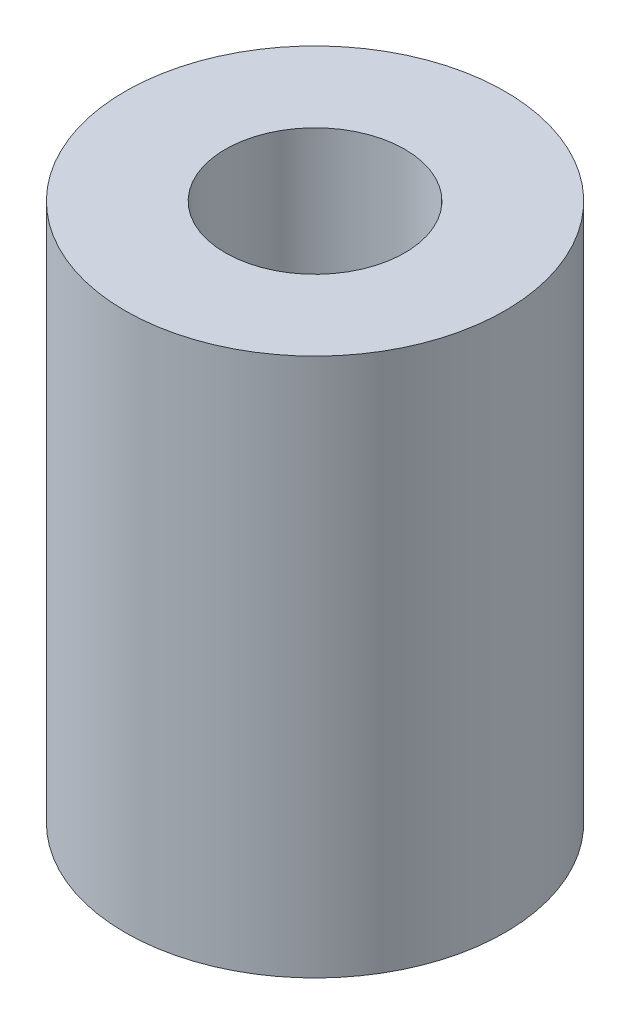
ISO-10303-21;
HEADER;
FILE_DESCRIPTION(('STEP AP214'),'2;1');
FILE_NAME('part.step','',(''),(''),'','','');
FILE_SCHEMA(('AUTOMOTIVE_DESIGN { 1 0 10303 214 1 1 1 1 }'));
ENDSEC;
DATA;
#1=APPLICATION_CONTEXT('core data for automotive mechanical design processes');
#2=APPLICATION_PROTOCOL_DEFINITION('international standard','automotive_design',2000,#1);
#3=PRODUCT_CONTEXT('',#1,'mechanical');
#4=PRODUCT('Part','Part','',(#3));
#5=PRODUCT_RELATED_PRODUCT_CATEGORY('part','',(#4));
#6=PRODUCT_DEFINITION_FORMATION('','',#4);
#7=PRODUCT_DEFINITION_CONTEXT('part definition',#1,'design');
#8=PRODUCT_DEFINITION('design','',#6,#7);
#9=PRODUCT_DEFINITION_SHAPE('','',#8);
#10=(LENGTH_UNIT() NAMED_UNIT(*) SI_UNIT(.MILLI.,.METRE.));
#11=(NAMED_UNIT(*) PLANE_ANGLE_UNIT() SI_UNIT($,.RADIAN.));
#12=(NAMED_UNIT(*) SI_UNIT($,.STERADIAN.) SOLID_ANGLE_UNIT());
#13=UNCERTAINTY_MEASURE_WITH_UNIT(LENGTH_MEASURE(1.E-05),#10,'distance_accuracy_value','');
#14=(GEOMETRIC_REPRESENTATION_CONTEXT(3) GLOBAL_UNCERTAINTY_ASSIGNED_CONTEXT((#13)) GLOBAL_UNIT_ASSIGNED_CONTEXT((#10,
#11,#12)) REPRESENTATION_CONTEXT('',''));
#15=CARTESIAN_POINT('',(0.,0.,0.));
#16=DIRECTION('',(0.,0.,1.));
#17=DIRECTION('',(1.,0.,0.));
#18=AXIS2_PLACEMENT_3D('',#15,#16,#17);
#19=CARTESIAN_POINT('',(0.,18.,0.));
#20=DIRECTION('',(0.,1.,0.));
#21=DIRECTION('',(0.,0.,1.));
#22=AXIS2_PLACEMENT_3D('',#19,#20,#21);
#23=PLANE('',#22);
#24=CARTESIAN_POINT('',(0.,18.,0.));
#25=DIRECTION('',(0.,1.,0.));
#26=DIRECTION('',(0.,0.,1.));
#27=AXIS2_PLACEMENT_3D('',#24,#25,#26);
#28=CIRCLE('',#27,6.35);
#29=CARTESIAN_POINT('',(0.,18.,6.35));
#30=VERTEX_POINT('',#29);
#31=EDGE_CURVE('E10',#30,#30,#28,.T.);
#32=ORIENTED_EDGE('',*,*,#31,.T.);
#33=EDGE_LOOP('',(#32));
#34=FACE_BOUND('',#33,.T.);
#35=CARTESIAN_POINT('',(0.,18.,0.));
#36=DIRECTION('',(0.,1.,0.));
#37=DIRECTION('',(0.,0.,1.));
#38=AXIS2_PLACEMENT_3D('',#35,#36,#37);
#39=CIRCLE('',#38,3.);
#40=CARTESIAN_POINT('',(0.,18.,3.));
#41=VERTEX_POINT('',#40);
#42=EDGE_CURVE('E46',#41,#41,#39,.T.);
#43=ORIENTED_EDGE('',*,*,#42,.F.);
#44=EDGE_LOOP('',(#43));
#45=FACE_BOUND('',#44,.T.);
#46=ADVANCED_FACE('F35',(#34,#45),#23,.T.);
#47=CARTESIAN_POINT('',(0.,0.,0.));
#48=DIRECTION('',(0.,1.,0.));
#49=DIRECTION('',(0.,0.,1.));
#50=AXIS2_PLACEMENT_3D('',#47,#48,#49);
#51=PLANE('',#50);
#52=CARTESIAN_POINT('',(0.,0.,0.));
#53=DIRECTION('',(0.,1.,0.));
#54=DIRECTION('',(0.,0.,1.));
#55=AXIS2_PLACEMENT_3D('',#52,#53,#54);
#56=CIRCLE('',#55,6.35);
#57=CARTESIAN_POINT('',(0.,0.,6.35));
#58=VERTEX_POINT('',#57);
#59=EDGE_CURVE('E39',#58,#58,#56,.T.);
#60=ORIENTED_EDGE('',*,*,#59,.F.);
#61=EDGE_LOOP('',(#60));
#62=FACE_BOUND('',#61,.T.);
#63=CARTESIAN_POINT('',(0.,0.,0.));
#64=DIRECTION('',(0.,1.,0.));
#65=DIRECTION('',(0.,0.,1.));
#66=AXIS2_PLACEMENT_3D('',#63,#64,#65);
#67=CIRCLE('',#66,3.);
#68=CARTESIAN_POINT('',(0.,0.,3.));
#69=VERTEX_POINT('',#68);
#70=EDGE_CURVE('E48',#69,#69,#67,.T.);
#71=ORIENTED_EDGE('',*,*,#70,.T.);
#72=EDGE_LOOP('',(#71));
#73=FACE_BOUND('',#72,.T.);
#74=ADVANCED_FACE('F58',(#62,#73),#51,.F.);
#75=CARTESIAN_POINT('',(0.,18.,0.));
#76=DIRECTION('',(0.,-1.,0.));
#77=DIRECTION('',(0.,0.,-1.));
#78=AXIS2_PLACEMENT_3D('',#75,#76,#77);
#79=CYLINDRICAL_SURFACE('',#78,6.35);
#80=ORIENTED_EDGE('',*,*,#31,.F.);
#81=EDGE_LOOP('',(#80));
#82=FACE_BOUND('',#81,.T.);
#83=ORIENTED_EDGE('',*,*,#59,.T.);
#84=EDGE_LOOP('',(#83));
#85=FACE_BOUND('',#84,.T.);
#86=ADVANCED_FACE('F37',(#82,#85),#79,.T.);
#87=CARTESIAN_POINT('',(0.,18.,0.));
#88=DIRECTION('',(0.,-1.,0.));
#89=DIRECTION('',(0.,0.,-1.));
#90=AXIS2_PLACEMENT_3D('',#87,#88,#89);
#91=CYLINDRICAL_SURFACE('',#90,3.);
#92=ORIENTED_EDGE('',*,*,#42,.T.);
#93=EDGE_LOOP('',(#92));
#94=FACE_BOUND('',#93,.T.);
#95=ORIENTED_EDGE('',*,*,#70,.F.);
#96=EDGE_LOOP('',(#95));
#97=FACE_BOUND('',#96,.T.);
#98=ADVANCED_FACE('F54',(#94,#97),#91,.F.);
#99=CLOSED_SHELL('',(#46,#74,#86,#98));
#100=MANIFOLD_SOLID_BREP('B2',#99);
#101=ADVANCED_BREP_SHAPE_REPRESENTATION('',(#18,#100),#14);
#102=SHAPE_DEFINITION_REPRESENTATION(#9,#101);
ENDSEC;
END-ISO-10303-21;
